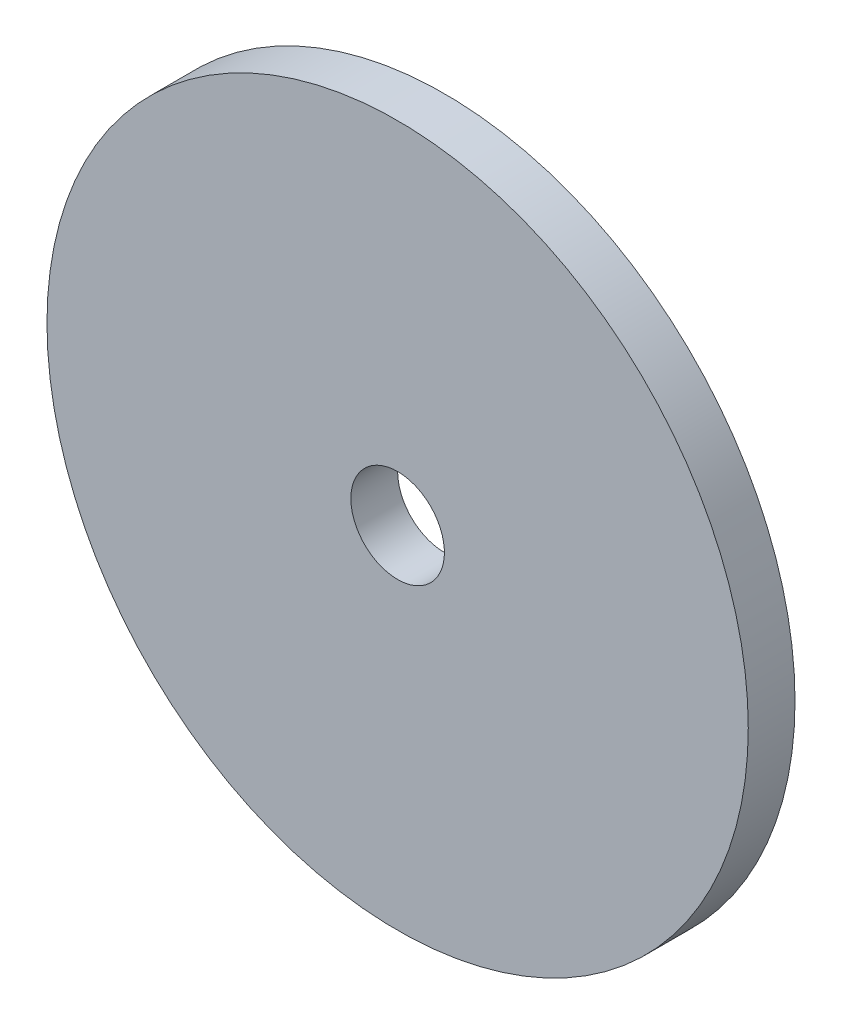
ISO-10303-21;
HEADER;
FILE_DESCRIPTION(('STEP AP214'),'2;1');
FILE_NAME('part.step','',(''),(''),'','','');
FILE_SCHEMA(('AUTOMOTIVE_DESIGN { 1 0 10303 214 1 1 1 1 }'));
ENDSEC;
DATA;
#1=APPLICATION_CONTEXT('core data for automotive mechanical design processes');
#2=APPLICATION_PROTOCOL_DEFINITION('international standard','automotive_design',2000,#1);
#3=PRODUCT_CONTEXT('',#1,'mechanical');
#4=PRODUCT('Part','Part','',(#3));
#5=PRODUCT_RELATED_PRODUCT_CATEGORY('part','',(#4));
#6=PRODUCT_DEFINITION_FORMATION('','',#4);
#7=PRODUCT_DEFINITION_CONTEXT('part definition',#1,'design');
#8=PRODUCT_DEFINITION('design','',#6,#7);
#9=PRODUCT_DEFINITION_SHAPE('','',#8);
#10=(LENGTH_UNIT() NAMED_UNIT(*) SI_UNIT(.MILLI.,.METRE.));
#11=(NAMED_UNIT(*) PLANE_ANGLE_UNIT() SI_UNIT($,.RADIAN.));
#12=(NAMED_UNIT(*) SI_UNIT($,.STERADIAN.) SOLID_ANGLE_UNIT());
#13=UNCERTAINTY_MEASURE_WITH_UNIT(LENGTH_MEASURE(1.E-05),#10,'distance_accuracy_value','');
#14=(GEOMETRIC_REPRESENTATION_CONTEXT(3) GLOBAL_UNCERTAINTY_ASSIGNED_CONTEXT((#13)) GLOBAL_UNIT_ASSIGNED_CONTEXT((#10,
#11,#12)) REPRESENTATION_CONTEXT('',''));
#15=CARTESIAN_POINT('',(0.,0.,0.));
#16=DIRECTION('',(0.,0.,1.));
#17=DIRECTION('',(1.,0.,0.));
#18=AXIS2_PLACEMENT_3D('',#15,#16,#17);
#19=CARTESIAN_POINT('',(0.,0.,1.5));
#20=DIRECTION('',(0.,0.,-1.));
#21=DIRECTION('',(-1.,0.,0.));
#22=AXIS2_PLACEMENT_3D('',#19,#20,#21);
#23=CYLINDRICAL_SURFACE('',#22,11.25);
#24=CARTESIAN_POINT('',(0.,0.,1.5));
#25=DIRECTION('',(0.,0.,1.));
#26=DIRECTION('',(1.,0.,0.));
#27=AXIS2_PLACEMENT_3D('',#24,#25,#26);
#28=CIRCLE('',#27,11.25);
#29=CARTESIAN_POINT('',(11.25,0.,1.5));
#30=VERTEX_POINT('',#29);
#31=EDGE_CURVE('E10',#30,#30,#28,.T.);
#32=ORIENTED_EDGE('',*,*,#31,.F.);
#33=EDGE_LOOP('',(#32));
#34=FACE_BOUND('',#33,.T.);
#35=CARTESIAN_POINT('',(0.,0.,0.));
#36=DIRECTION('',(0.,0.,1.));
#37=DIRECTION('',(1.,0.,0.));
#38=AXIS2_PLACEMENT_3D('',#35,#36,#37);
#39=CIRCLE('',#38,11.25);
#40=CARTESIAN_POINT('',(11.25,0.,0.));
#41=VERTEX_POINT('',#40);
#42=EDGE_CURVE('E46',#41,#41,#39,.T.);
#43=ORIENTED_EDGE('',*,*,#42,.T.);
#44=EDGE_LOOP('',(#43));
#45=FACE_BOUND('',#44,.T.);
#46=ADVANCED_FACE('F43',(#34,#45),#23,.T.);
#47=CARTESIAN_POINT('',(0.,0.,1.5));
#48=DIRECTION('',(0.,0.,1.));
#49=DIRECTION('',(1.,0.,0.));
#50=AXIS2_PLACEMENT_3D('',#47,#48,#49);
#51=PLANE('',#50);
#52=CARTESIAN_POINT('',(0.,0.,1.5));
#53=DIRECTION('',(0.,0.,-1.));
#54=DIRECTION('',(-1.,0.,0.));
#55=AXIS2_PLACEMENT_3D('',#52,#53,#54);
#56=CIRCLE('',#55,1.5);
#57=CARTESIAN_POINT('',(-1.5,0.,1.5));
#58=VERTEX_POINT('',#57);
#59=EDGE_CURVE('E55',#58,#58,#56,.T.);
#60=ORIENTED_EDGE('',*,*,#59,.T.);
#61=EDGE_LOOP('',(#60));
#62=FACE_BOUND('',#61,.T.);
#63=ORIENTED_EDGE('',*,*,#31,.T.);
#64=EDGE_LOOP('',(#63));
#65=FACE_BOUND('',#64,.T.);
#66=ADVANCED_FACE('F71',(#62,#65),#51,.T.);
#67=CARTESIAN_POINT('',(0.,0.,0.));
#68=DIRECTION('',(0.,0.,1.));
#69=DIRECTION('',(1.,0.,0.));
#70=AXIS2_PLACEMENT_3D('',#67,#68,#69);
#71=PLANE('',#70);
#72=CARTESIAN_POINT('',(0.,0.,0.));
#73=DIRECTION('',(0.,0.,-1.));
#74=DIRECTION('',(-1.,0.,0.));
#75=AXIS2_PLACEMENT_3D('',#72,#73,#74);
#76=CIRCLE('',#75,1.5);
#77=CARTESIAN_POINT('',(-1.5,0.,0.));
#78=VERTEX_POINT('',#77);
#79=EDGE_CURVE('E60',#78,#78,#76,.T.);
#80=ORIENTED_EDGE('',*,*,#79,.F.);
#81=EDGE_LOOP('',(#80));
#82=FACE_BOUND('',#81,.T.);
#83=ORIENTED_EDGE('',*,*,#42,.F.);
#84=EDGE_LOOP('',(#83));
#85=FACE_BOUND('',#84,.T.);
#86=ADVANCED_FACE('F68',(#82,#85),#71,.F.);
#87=CARTESIAN_POINT('',(0.,0.,0.));
#88=DIRECTION('',(0.,0.,-1.));
#89=DIRECTION('',(-1.,0.,0.));
#90=AXIS2_PLACEMENT_3D('',#87,#88,#89);
#91=CYLINDRICAL_SURFACE('',#90,1.5);
#92=ORIENTED_EDGE('',*,*,#79,.T.);
#93=EDGE_LOOP('',(#92));
#94=FACE_BOUND('',#93,.T.);
#95=ORIENTED_EDGE('',*,*,#59,.F.);
#96=EDGE_LOOP('',(#95));
#97=FACE_BOUND('',#96,.T.);
#98=ADVANCED_FACE('F65',(#94,#97),#91,.F.);
#99=CLOSED_SHELL('',(#46,#66,#86,#98));
#100=MANIFOLD_SOLID_BREP('B2',#99);
#101=ADVANCED_BREP_SHAPE_REPRESENTATION('',(#18,#100),#14);
#102=SHAPE_DEFINITION_REPRESENTATION(#9,#101);
ENDSEC;
END-ISO-10303-21;
